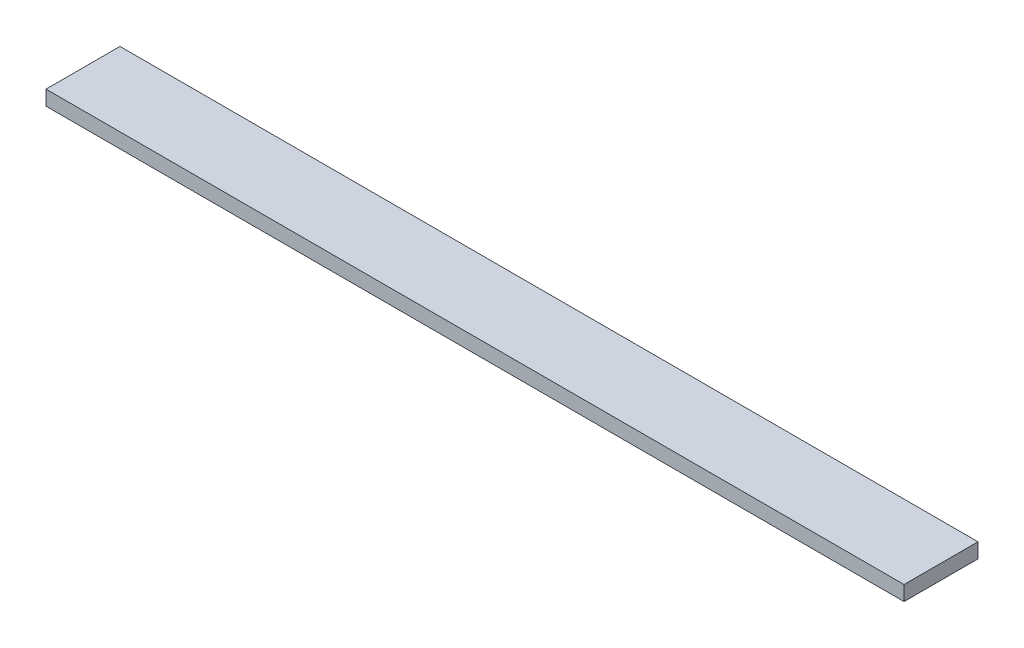
ISO-10303-21;
HEADER;
FILE_DESCRIPTION(('STEP AP214'),'2;1');
FILE_NAME('part.step','',(''),(''),'','','');
FILE_SCHEMA(('AUTOMOTIVE_DESIGN { 1 0 10303 214 1 1 1 1 }'));
ENDSEC;
DATA;
#1=APPLICATION_CONTEXT('core data for automotive mechanical design processes');
#2=APPLICATION_PROTOCOL_DEFINITION('international standard','automotive_design',2000,#1);
#3=PRODUCT_CONTEXT('',#1,'mechanical');
#4=PRODUCT('Part','Part','',(#3));
#5=PRODUCT_RELATED_PRODUCT_CATEGORY('part','',(#4));
#6=PRODUCT_DEFINITION_FORMATION('','',#4);
#7=PRODUCT_DEFINITION_CONTEXT('part definition',#1,'design');
#8=PRODUCT_DEFINITION('design','',#6,#7);
#9=PRODUCT_DEFINITION_SHAPE('','',#8);
#10=(LENGTH_UNIT() NAMED_UNIT(*) SI_UNIT(.MILLI.,.METRE.));
#11=(NAMED_UNIT(*) PLANE_ANGLE_UNIT() SI_UNIT($,.RADIAN.));
#12=(NAMED_UNIT(*) SI_UNIT($,.STERADIAN.) SOLID_ANGLE_UNIT());
#13=UNCERTAINTY_MEASURE_WITH_UNIT(LENGTH_MEASURE(1.E-05),#10,'distance_accuracy_value','');
#14=(GEOMETRIC_REPRESENTATION_CONTEXT(3) GLOBAL_UNCERTAINTY_ASSIGNED_CONTEXT((#13)) GLOBAL_UNIT_ASSIGNED_CONTEXT((#10,
#11,#12)) REPRESENTATION_CONTEXT('',''));
#15=CARTESIAN_POINT('',(0.,0.,0.));
#16=DIRECTION('',(0.,0.,1.));
#17=DIRECTION('',(1.,0.,0.));
#18=AXIS2_PLACEMENT_3D('',#15,#16,#17);
#19=CARTESIAN_POINT('',(147.32,5.08,12.7));
#20=DIRECTION('',(-1.,0.,0.));
#21=DIRECTION('',(0.,0.,1.));
#22=AXIS2_PLACEMENT_3D('',#19,#20,#21);
#23=PLANE('',#22);
#24=DIRECTION('',(0.,0.,-1.));
#25=VECTOR('',#24,1.);
#26=CARTESIAN_POINT('',(147.32,0.,12.7));
#27=LINE('',#26,#25);
#28=CARTESIAN_POINT('',(147.32,0.,12.7));
#29=VERTEX_POINT('',#28);
#30=CARTESIAN_POINT('',(147.32,0.,-12.7));
#31=VERTEX_POINT('',#30);
#32=EDGE_CURVE('E107',#29,#31,#27,.T.);
#33=ORIENTED_EDGE('',*,*,#32,.T.);
#34=DIRECTION('',(0.,-1.,0.));
#35=VECTOR('',#34,1.);
#36=CARTESIAN_POINT('',(147.32,5.08,-12.7));
#37=LINE('',#36,#35);
#38=CARTESIAN_POINT('',(147.32,5.08,-12.7));
#39=VERTEX_POINT('',#38);
#40=EDGE_CURVE('E11',#39,#31,#37,.T.);
#41=ORIENTED_EDGE('',*,*,#40,.F.);
#42=DIRECTION('',(0.,0.,-1.));
#43=VECTOR('',#42,1.);
#44=CARTESIAN_POINT('',(147.32,5.08,12.7));
#45=LINE('',#44,#43);
#46=CARTESIAN_POINT('',(147.32,5.08,12.7));
#47=VERTEX_POINT('',#46);
#48=EDGE_CURVE('E91',#47,#39,#45,.T.);
#49=ORIENTED_EDGE('',*,*,#48,.F.);
#50=DIRECTION('',(0.,-1.,0.));
#51=VECTOR('',#50,1.);
#52=CARTESIAN_POINT('',(147.32,5.08,12.7));
#53=LINE('',#52,#51);
#54=EDGE_CURVE('E103',#47,#29,#53,.T.);
#55=ORIENTED_EDGE('',*,*,#54,.T.);
#56=EDGE_LOOP('',(#33,#41,#49,#55));
#57=FACE_BOUND('',#56,.T.);
#58=ADVANCED_FACE('F39',(#57),#23,.F.);
#59=CARTESIAN_POINT('',(-147.32,5.08,-12.7));
#60=DIRECTION('',(0.,0.,1.));
#61=DIRECTION('',(1.,0.,0.));
#62=AXIS2_PLACEMENT_3D('',#59,#60,#61);
#63=PLANE('',#62);
#64=DIRECTION('',(-1.,0.,0.));
#65=VECTOR('',#64,1.);
#66=CARTESIAN_POINT('',(-147.32,0.,-12.7));
#67=LINE('',#66,#65);
#68=CARTESIAN_POINT('',(-147.32,0.,-12.7));
#69=VERTEX_POINT('',#68);
#70=EDGE_CURVE('E96',#31,#69,#67,.T.);
#71=ORIENTED_EDGE('',*,*,#70,.T.);
#72=DIRECTION('',(0.,-1.,0.));
#73=VECTOR('',#72,1.);
#74=CARTESIAN_POINT('',(-147.32,5.08,-12.7));
#75=LINE('',#74,#73);
#76=CARTESIAN_POINT('',(-147.32,5.08,-12.7));
#77=VERTEX_POINT('',#76);
#78=EDGE_CURVE('E48',#77,#69,#75,.T.);
#79=ORIENTED_EDGE('',*,*,#78,.F.);
#80=DIRECTION('',(-1.,0.,0.));
#81=VECTOR('',#80,1.);
#82=CARTESIAN_POINT('',(-147.32,5.08,-12.7));
#83=LINE('',#82,#81);
#84=EDGE_CURVE('E86',#39,#77,#83,.T.);
#85=ORIENTED_EDGE('',*,*,#84,.F.);
#86=ORIENTED_EDGE('',*,*,#40,.T.);
#87=EDGE_LOOP('',(#71,#79,#85,#86));
#88=FACE_BOUND('',#87,.T.);
#89=ADVANCED_FACE('F95',(#88),#63,.F.);
#90=CARTESIAN_POINT('',(-147.32,5.08,12.7));
#91=DIRECTION('',(1.,0.,0.));
#92=DIRECTION('',(0.,0.,-1.));
#93=AXIS2_PLACEMENT_3D('',#90,#91,#92);
#94=PLANE('',#93);
#95=DIRECTION('',(0.,0.,1.));
#96=VECTOR('',#95,1.);
#97=CARTESIAN_POINT('',(-147.32,0.,12.7));
#98=LINE('',#97,#96);
#99=CARTESIAN_POINT('',(-147.32,0.,12.7));
#100=VERTEX_POINT('',#99);
#101=EDGE_CURVE('E73',#69,#100,#98,.T.);
#102=ORIENTED_EDGE('',*,*,#101,.T.);
#103=DIRECTION('',(0.,-1.,0.));
#104=VECTOR('',#103,1.);
#105=CARTESIAN_POINT('',(-147.32,5.08,12.7));
#106=LINE('',#105,#104);
#107=CARTESIAN_POINT('',(-147.32,5.08,12.7));
#108=VERTEX_POINT('',#107);
#109=EDGE_CURVE('E98',#108,#100,#106,.T.);
#110=ORIENTED_EDGE('',*,*,#109,.F.);
#111=DIRECTION('',(0.,0.,1.));
#112=VECTOR('',#111,1.);
#113=CARTESIAN_POINT('',(-147.32,5.08,12.7));
#114=LINE('',#113,#112);
#115=EDGE_CURVE('E89',#77,#108,#114,.T.);
#116=ORIENTED_EDGE('',*,*,#115,.F.);
#117=ORIENTED_EDGE('',*,*,#78,.T.);
#118=EDGE_LOOP('',(#102,#110,#116,#117));
#119=FACE_BOUND('',#118,.T.);
#120=ADVANCED_FACE('F99',(#119),#94,.F.);
#121=CARTESIAN_POINT('',(-147.32,5.08,12.7));
#122=DIRECTION('',(0.,0.,-1.));
#123=DIRECTION('',(-1.,0.,0.));
#124=AXIS2_PLACEMENT_3D('',#121,#122,#123);
#125=PLANE('',#124);
#126=DIRECTION('',(1.,0.,0.));
#127=VECTOR('',#126,1.);
#128=CARTESIAN_POINT('',(-147.32,0.,12.7));
#129=LINE('',#128,#127);
#130=EDGE_CURVE('E79',#100,#29,#129,.T.);
#131=ORIENTED_EDGE('',*,*,#130,.T.);
#132=ORIENTED_EDGE('',*,*,#54,.F.);
#133=DIRECTION('',(1.,0.,0.));
#134=VECTOR('',#133,1.);
#135=CARTESIAN_POINT('',(-147.32,5.08,12.7));
#136=LINE('',#135,#134);
#137=EDGE_CURVE('E56',#108,#47,#136,.T.);
#138=ORIENTED_EDGE('',*,*,#137,.F.);
#139=ORIENTED_EDGE('',*,*,#109,.T.);
#140=EDGE_LOOP('',(#131,#132,#138,#139));
#141=FACE_BOUND('',#140,.T.);
#142=ADVANCED_FACE('F120',(#141),#125,.F.);
#143=CARTESIAN_POINT('',(0.,5.08,0.));
#144=DIRECTION('',(0.,-1.,0.));
#145=DIRECTION('',(0.,0.,-1.));
#146=AXIS2_PLACEMENT_3D('',#143,#144,#145);
#147=PLANE('',#146);
#148=ORIENTED_EDGE('',*,*,#48,.T.);
#149=ORIENTED_EDGE('',*,*,#84,.T.);
#150=ORIENTED_EDGE('',*,*,#115,.T.);
#151=ORIENTED_EDGE('',*,*,#137,.T.);
#152=EDGE_LOOP('',(#148,#149,#150,#151));
#153=FACE_BOUND('',#152,.T.);
#154=ADVANCED_FACE('F87',(#153),#147,.F.);
#155=CARTESIAN_POINT('',(0.,0.,0.));
#156=DIRECTION('',(0.,-1.,0.));
#157=DIRECTION('',(0.,0.,-1.));
#158=AXIS2_PLACEMENT_3D('',#155,#156,#157);
#159=PLANE('',#158);
#160=ORIENTED_EDGE('',*,*,#32,.F.);
#161=ORIENTED_EDGE('',*,*,#130,.F.);
#162=ORIENTED_EDGE('',*,*,#101,.F.);
#163=ORIENTED_EDGE('',*,*,#70,.F.);
#164=EDGE_LOOP('',(#160,#161,#162,#163));
#165=FACE_BOUND('',#164,.T.);
#166=ADVANCED_FACE('F123',(#165),#159,.T.);
#167=CLOSED_SHELL('',(#58,#89,#120,#142,#154,#166));
#168=MANIFOLD_SOLID_BREP('B2',#167);
#169=ADVANCED_BREP_SHAPE_REPRESENTATION('',(#18,#168),#14);
#170=SHAPE_DEFINITION_REPRESENTATION(#9,#169);
ENDSEC;
END-ISO-10303-21;
